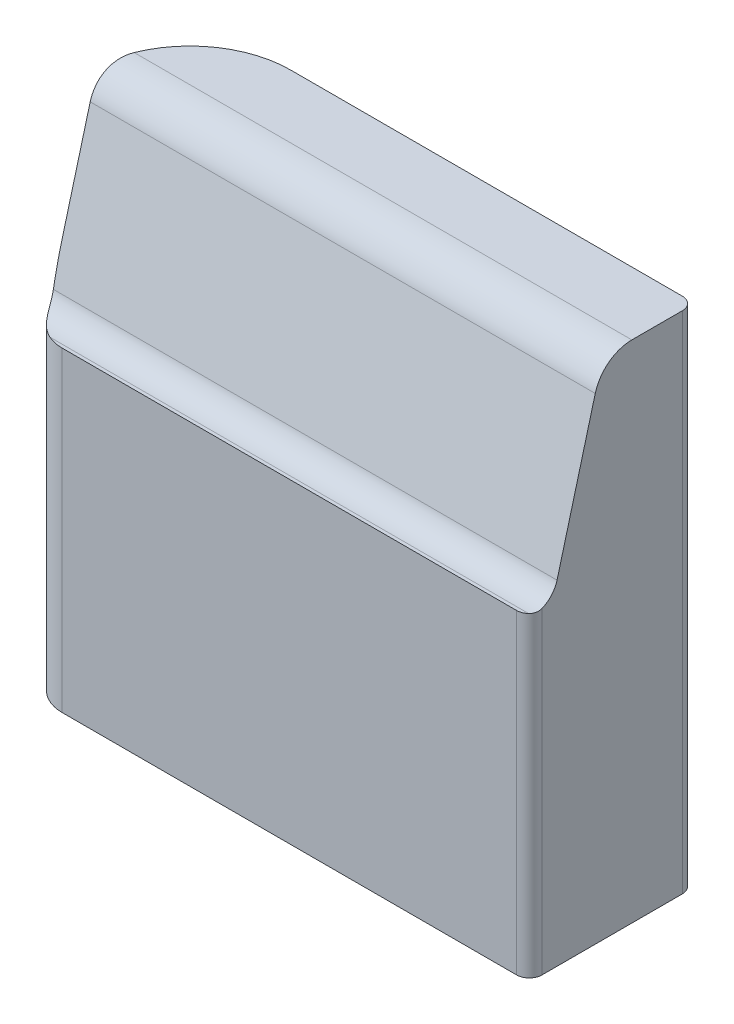
ISO-10303-21;
HEADER;
FILE_DESCRIPTION(('STEP AP214'),'2;1');
FILE_NAME('part.step','',(''),(''),'','','');
FILE_SCHEMA(('AUTOMOTIVE_DESIGN { 1 0 10303 214 1 1 1 1 }'));
ENDSEC;
DATA;
#1=APPLICATION_CONTEXT('core data for automotive mechanical design processes');
#2=APPLICATION_PROTOCOL_DEFINITION('international standard','automotive_design',2000,#1);
#3=PRODUCT_CONTEXT('',#1,'mechanical');
#4=PRODUCT('Part','Part','',(#3));
#5=PRODUCT_RELATED_PRODUCT_CATEGORY('part','',(#4));
#6=PRODUCT_DEFINITION_FORMATION('','',#4);
#7=PRODUCT_DEFINITION_CONTEXT('part definition',#1,'design');
#8=PRODUCT_DEFINITION('design','',#6,#7);
#9=PRODUCT_DEFINITION_SHAPE('','',#8);
#10=(LENGTH_UNIT() NAMED_UNIT(*) SI_UNIT(.MILLI.,.METRE.));
#11=(NAMED_UNIT(*) PLANE_ANGLE_UNIT() SI_UNIT($,.RADIAN.));
#12=(NAMED_UNIT(*) SI_UNIT($,.STERADIAN.) SOLID_ANGLE_UNIT());
#13=UNCERTAINTY_MEASURE_WITH_UNIT(LENGTH_MEASURE(1.E-05),#10,'distance_accuracy_value','');
#14=(GEOMETRIC_REPRESENTATION_CONTEXT(3) GLOBAL_UNCERTAINTY_ASSIGNED_CONTEXT((#13)) GLOBAL_UNIT_ASSIGNED_CONTEXT((#10,
#11,#12)) REPRESENTATION_CONTEXT('',''));
#15=CARTESIAN_POINT('',(0.,0.,0.));
#16=DIRECTION('',(0.,0.,1.));
#17=DIRECTION('',(1.,0.,0.));
#18=AXIS2_PLACEMENT_3D('',#15,#16,#17);
#19=CARTESIAN_POINT('',(20.,-3.,5.));
#20=DIRECTION('',(-1.,0.,0.));
#21=DIRECTION('',(0.,0.,1.));
#22=AXIS2_PLACEMENT_3D('',#19,#20,#21);
#23=CYLINDRICAL_SURFACE('',#22,3.);
#24=DIRECTION('',(-1.,0.,0.));
#25=VECTOR('',#24,1.);
#26=CARTESIAN_POINT('',(20.,0.,5.));
#27=LINE('',#26,#25);
#28=CARTESIAN_POINT('',(20.,0.,5.));
#29=VERTEX_POINT('',#28);
#30=CARTESIAN_POINT('',(-19.4161984870957,0.,5.));
#31=VERTEX_POINT('',#30);
#32=EDGE_CURVE('E183',#29,#31,#27,.T.);
#33=ORIENTED_EDGE('',*,*,#32,.T.);
#34=CARTESIAN_POINT('',(-19.4161984870957,0.,5.));
#35=CARTESIAN_POINT('',(-19.4476398910571,8.44615215946744E-06,5.07769598822021));
#36=CARTESIAN_POINT('',(-19.4778448347174,-0.00301875547096458,5.155905999336));
#37=CARTESIAN_POINT('',(-19.5356515093298,-0.0153183936879546,5.3128258372859));
#38=CARTESIAN_POINT('',(-19.5632522820662,-0.0245931189469453,5.39153583681081));
#39=CARTESIAN_POINT('',(-19.6157162275312,-0.0495711248398902,5.54892712936012));
#40=CARTESIAN_POINT('',(-19.6405773852055,-0.0652790977595611,5.62760835938605));
#41=CARTESIAN_POINT('',(-19.6874565688875,-0.103189547508719,5.78421388711505));
#42=CARTESIAN_POINT('',(-19.7094750016502,-0.125391093708975,5.8621382916306));
#43=CARTESIAN_POINT('',(-19.771329198685,-0.201933977518062,6.09422279218903));
#44=CARTESIAN_POINT('',(-19.8068739890091,-0.266171386367017,6.2464211560772));
#45=CARTESIAN_POINT('',(-19.8669872290354,-0.419842800390661,6.53953554478387));
#46=CARTESIAN_POINT('',(-19.8915692423017,-0.509245445419557,6.68046533324962));
#47=CARTESIAN_POINT('',(-19.9307456722422,-0.707411825846414,6.94164253575932));
#48=CARTESIAN_POINT('',(-19.9456596657797,-0.815388020681755,7.0624413560816));
#49=CARTESIAN_POINT('',(-19.9688210405371,-1.04995090657302,7.28549813096223));
#50=CARTESIAN_POINT('',(-19.9770612888708,-1.17655733931868,7.38773615750423));
#51=CARTESIAN_POINT('',(-19.9861108573365,-1.38001634318352,7.52641157421995));
#52=CARTESIAN_POINT('',(-19.9885878620751,-1.45149140429164,7.57083734672452));
#53=CARTESIAN_POINT('',(-19.9926020993526,-1.59796188968992,7.6535548795928));
#54=CARTESIAN_POINT('',(-19.9941392743925,-1.67295752906751,7.69184626454784));
#55=CARTESIAN_POINT('',(-19.9965356521875,-1.82586769254523,7.76197118100954));
#56=CARTESIAN_POINT('',(-19.9973951939427,-1.90378073669086,7.79380793565077));
#57=CARTESIAN_POINT('',(-19.9986580518514,-2.06200274569308,7.85083227948489));
#58=CARTESIAN_POINT('',(-19.9990613891509,-2.14231159932233,7.8760201768232));
#59=CARTESIAN_POINT('',(-19.9993468831007,-2.22354286469243,7.8977774788672));
#60=B_SPLINE_CURVE_WITH_KNOTS('',3,(#34,#35,#36,#37,#38,#39,#40,#41,#42,#43,#44,#45,#46,#47,#48,
#49,#50,#51,#52,#53,#54,#55,#56,#57,#58,#59),.UNSPECIFIED.,.F.,.F.,(4,2,2,2,2,2,2,2,2,2,2,2,4),
(0.,0.251402016056363,0.502896178728765,0.754574103963112,1.00621597752705,1.51035980882775,
2.01387815194398,2.49976580321802,2.98617208748072,3.23850001379153,3.4908433760256,
3.74306041796446,3.99526576869457),.UNSPECIFIED.);
#61=CARTESIAN_POINT('',(-19.9993468831007,-2.22354286469243,7.8977774788672));
#62=VERTEX_POINT('',#61);
#63=EDGE_CURVE('E258',#31,#62,#60,.T.);
#64=ORIENTED_EDGE('',*,*,#63,.T.);
#65=DIRECTION('',(-1.,0.,0.));
#66=VECTOR('',#65,1.);
#67=CARTESIAN_POINT('',(20.,-2.22354286469243,7.8977774788672));
#68=LINE('',#67,#66);
#69=CARTESIAN_POINT('',(20.,-2.22354286469243,7.8977774788672));
#70=VERTEX_POINT('',#69);
#71=EDGE_CURVE('E200',#70,#62,#68,.T.);
#72=ORIENTED_EDGE('',*,*,#71,.F.);
#73=CARTESIAN_POINT('',(20.,-3.,5.));
#74=DIRECTION('',(1.,0.,0.));
#75=DIRECTION('',(0.,0.,1.));
#76=AXIS2_PLACEMENT_3D('',#73,#74,#75);
#77=CIRCLE('',#76,3.);
#78=EDGE_CURVE('E171',#29,#70,#77,.T.);
#79=ORIENTED_EDGE('',*,*,#78,.F.);
#80=EDGE_LOOP('',(#33,#64,#72,#79));
#81=FACE_BOUND('',#80,.T.);
#82=ADVANCED_FACE('F50',(#81),#23,.T.);
#83=CARTESIAN_POINT('',(20.,-15.,11.3212188504038));
#84=DIRECTION('',(0.,-0.258819045102525,-0.965925826289067));
#85=DIRECTION('',(0.,0.965925826289067,-0.258819045102525));
#86=AXIS2_PLACEMENT_3D('',#83,#84,#85);
#87=PLANE('',#86);
#88=DIRECTION('',(0.,-0.965925826289067,0.258819045102525));
#89=VECTOR('',#88,1.);
#90=CARTESIAN_POINT('',(-20.,-15.,11.3212188504038));
#91=LINE('',#90,#89);
#92=CARTESIAN_POINT('',(-20.,-2.60504250723782,8.));
#93=VERTEX_POINT('',#92);
#94=CARTESIAN_POINT('',(-20.,-10.5169902192837,10.12));
#95=VERTEX_POINT('',#94);
#96=EDGE_CURVE('E170',#93,#95,#91,.T.);
#97=ORIENTED_EDGE('',*,*,#96,.T.);
#98=CARTESIAN_POINT('',(-17.,-10.5169902192837,10.12));
#99=DIRECTION('',(0.,-0.258819045102525,-0.965925826289067));
#100=DIRECTION('',(0.,0.965925826289067,-0.258819045102525));
#101=AXIS2_PLACEMENT_3D('',#98,#99,#100);
#102=ELLIPSE('',#101,11.5911099154686,3.);
#103=CARTESIAN_POINT('',(-19.8902508458796,-13.5176380902051,10.9240211737836));
#104=VERTEX_POINT('',#103);
#105=EDGE_CURVE('E73',#95,#104,#102,.F.);
#106=ORIENTED_EDGE('',*,*,#105,.T.);
#107=DIRECTION('',(-1.,0.,0.));
#108=VECTOR('',#107,1.);
#109=CARTESIAN_POINT('',(20.,-13.5176380902051,10.9240211737836));
#110=LINE('',#109,#108);
#111=CARTESIAN_POINT('',(20.,-13.5176380902051,10.9240211737836));
#112=VERTEX_POINT('',#111);
#113=EDGE_CURVE('E224',#104,#112,#110,.F.);
#114=ORIENTED_EDGE('',*,*,#113,.T.);
#115=DIRECTION('',(0.,-0.965925826289067,0.258819045102525));
#116=VECTOR('',#115,1.);
#117=CARTESIAN_POINT('',(20.,-15.,11.3212188504038));
#118=LINE('',#117,#116);
#119=EDGE_CURVE('E174',#70,#112,#118,.T.);
#120=ORIENTED_EDGE('',*,*,#119,.F.);
#121=ORIENTED_EDGE('',*,*,#71,.T.);
#122=CARTESIAN_POINT('',(-12.,-2.60504250723782,8.));
#123=DIRECTION('',(0.,-0.258819045102525,-0.965925826289067));
#124=DIRECTION('',(0.,-0.965925826289067,0.258819045102525));
#125=AXIS2_PLACEMENT_3D('',#122,#123,#124);
#126=ELLIPSE('',#125,30.9096264412497,8.);
#127=EDGE_CURVE('E264',#62,#93,#126,.F.);
#128=ORIENTED_EDGE('',*,*,#127,.T.);
#129=EDGE_LOOP('',(#97,#106,#114,#120,#121,#128));
#130=FACE_BOUND('',#129,.T.);
#131=ADVANCED_FACE('F254',(#130),#87,.F.);
#132=CARTESIAN_POINT('',(20.,-15.,13.12));
#133=DIRECTION('',(0.,-1.,0.));
#134=DIRECTION('',(0.,0.,-1.));
#135=AXIS2_PLACEMENT_3D('',#132,#133,#134);
#136=PLANE('',#135);
#137=DIRECTION('',(-1.,0.,0.));
#138=VECTOR('',#137,1.);
#139=CARTESIAN_POINT('',(-20.,-15.,12.8558728263617));
#140=LINE('',#139,#138);
#141=CARTESIAN_POINT('',(19.6771197703674,-15.,12.8558728263617));
#142=VERTEX_POINT('',#141);
#143=CARTESIAN_POINT('',(-18.2308533129401,-15.,12.8558728263617));
#144=VERTEX_POINT('',#143);
#145=EDGE_CURVE('E222',#142,#144,#140,.T.);
#146=ORIENTED_EDGE('',*,*,#145,.T.);
#147=CARTESIAN_POINT('',(-17.,-15.,10.12));
#148=DIRECTION('',(0.,-1.,0.));
#149=DIRECTION('',(0.,0.,-1.));
#150=AXIS2_PLACEMENT_3D('',#147,#148,#149);
#151=CIRCLE('',#150,3.);
#152=CARTESIAN_POINT('',(-17.,-15.,13.12));
#153=VERTEX_POINT('',#152);
#154=EDGE_CURVE('E11',#144,#153,#151,.F.);
#155=ORIENTED_EDGE('',*,*,#154,.T.);
#156=DIRECTION('',(-1.,0.,0.));
#157=VECTOR('',#156,1.);
#158=CARTESIAN_POINT('',(20.,-15.,13.12));
#159=LINE('',#158,#157);
#160=CARTESIAN_POINT('',(19.,-15.,13.12));
#161=VERTEX_POINT('',#160);
#162=EDGE_CURVE('E197',#161,#153,#159,.T.);
#163=ORIENTED_EDGE('',*,*,#162,.F.);
#164=CARTESIAN_POINT('',(19.,-15.,12.12));
#165=DIRECTION('',(0.,-1.,0.));
#166=DIRECTION('',(0.,0.,-1.));
#167=AXIS2_PLACEMENT_3D('',#164,#165,#166);
#168=CIRCLE('',#167,1.);
#169=EDGE_CURVE('E219',#161,#142,#168,.F.);
#170=ORIENTED_EDGE('',*,*,#169,.T.);
#171=EDGE_LOOP('',(#146,#155,#163,#170));
#172=FACE_BOUND('',#171,.T.);
#173=ADVANCED_FACE('F310',(#172),#136,.F.);
#174=CARTESIAN_POINT('',(20.,-40.,13.12));
#175=DIRECTION('',(0.,0.,-1.));
#176=DIRECTION('',(-1.,0.,0.));
#177=AXIS2_PLACEMENT_3D('',#174,#175,#176);
#178=PLANE('',#177);
#179=ORIENTED_EDGE('',*,*,#162,.T.);
#180=DIRECTION('',(0.,-1.,0.));
#181=VECTOR('',#180,1.);
#182=CARTESIAN_POINT('',(-17.,-40.,13.12));
#183=LINE('',#182,#181);
#184=CARTESIAN_POINT('',(-17.,-40.,13.12));
#185=VERTEX_POINT('',#184);
#186=EDGE_CURVE('E289',#153,#185,#183,.T.);
#187=ORIENTED_EDGE('',*,*,#186,.T.);
#188=DIRECTION('',(-1.,0.,0.));
#189=VECTOR('',#188,1.);
#190=CARTESIAN_POINT('',(20.,-40.,13.12));
#191=LINE('',#190,#189);
#192=CARTESIAN_POINT('',(19.,-40.,13.12));
#193=VERTEX_POINT('',#192);
#194=EDGE_CURVE('E194',#193,#185,#191,.T.);
#195=ORIENTED_EDGE('',*,*,#194,.F.);
#196=DIRECTION('',(0.,-1.,0.));
#197=VECTOR('',#196,1.);
#198=CARTESIAN_POINT('',(19.,-40.,13.12));
#199=LINE('',#198,#197);
#200=EDGE_CURVE('E217',#193,#161,#199,.F.);
#201=ORIENTED_EDGE('',*,*,#200,.T.);
#202=EDGE_LOOP('',(#179,#187,#195,#201));
#203=FACE_BOUND('',#202,.T.);
#204=ADVANCED_FACE('F313',(#203),#178,.F.);
#205=CARTESIAN_POINT('',(20.,-40.,0.));
#206=DIRECTION('',(0.,1.,0.));
#207=DIRECTION('',(0.,0.,1.));
#208=AXIS2_PLACEMENT_3D('',#205,#206,#207);
#209=PLANE('',#208);
#210=CARTESIAN_POINT('',(13.,-40.,6.56));
#211=DIRECTION('',(0.,-1.,0.));
#212=DIRECTION('',(0.,0.,-1.));
#213=AXIS2_PLACEMENT_3D('',#210,#211,#212);
#214=CIRCLE('',#213,3.025);
#215=CARTESIAN_POINT('',(13.,-40.,3.535));
#216=VERTEX_POINT('',#215);
#217=EDGE_CURVE('E161',#216,#216,#214,.T.);
#218=ORIENTED_EDGE('',*,*,#217,.F.);
#219=EDGE_LOOP('',(#218));
#220=FACE_BOUND('',#219,.T.);
#221=CARTESIAN_POINT('',(-9.86933288150908,-40.,6.56));
#222=DIRECTION('',(0.,-1.,0.));
#223=DIRECTION('',(0.,0.,-1.));
#224=AXIS2_PLACEMENT_3D('',#221,#222,#223);
#225=CIRCLE('',#224,3.025);
#226=CARTESIAN_POINT('',(-9.86933288150908,-40.,3.535));
#227=VERTEX_POINT('',#226);
#228=EDGE_CURVE('E154',#227,#227,#225,.T.);
#229=ORIENTED_EDGE('',*,*,#228,.F.);
#230=EDGE_LOOP('',(#229));
#231=FACE_BOUND('',#230,.T.);
#232=ORIENTED_EDGE('',*,*,#194,.T.);
#233=CARTESIAN_POINT('',(-17.,-40.,10.12));
#234=DIRECTION('',(0.,1.,0.));
#235=DIRECTION('',(0.,0.,1.));
#236=AXIS2_PLACEMENT_3D('',#233,#234,#235);
#237=CIRCLE('',#236,3.);
#238=CARTESIAN_POINT('',(-20.,-40.,10.12));
#239=VERTEX_POINT('',#238);
#240=EDGE_CURVE('E292',#185,#239,#237,.F.);
#241=ORIENTED_EDGE('',*,*,#240,.T.);
#242=DIRECTION('',(0.,0.,-1.));
#243=VECTOR('',#242,1.);
#244=CARTESIAN_POINT('',(-20.,-40.,0.));
#245=LINE('',#244,#243);
#246=CARTESIAN_POINT('',(-20.,-40.,7.99999999999999));
#247=VERTEX_POINT('',#246);
#248=EDGE_CURVE('E175',#239,#247,#245,.T.);
#249=ORIENTED_EDGE('',*,*,#248,.T.);
#250=CARTESIAN_POINT('',(-12.,-40.,7.99999999999999));
#251=DIRECTION('',(0.,1.,0.));
#252=DIRECTION('',(0.,0.,1.));
#253=AXIS2_PLACEMENT_3D('',#250,#251,#252);
#254=CIRCLE('',#253,8.);
#255=CARTESIAN_POINT('',(-12.,-40.,0.));
#256=VERTEX_POINT('',#255);
#257=EDGE_CURVE('E282',#247,#256,#254,.F.);
#258=ORIENTED_EDGE('',*,*,#257,.T.);
#259=DIRECTION('',(-1.,0.,0.));
#260=VECTOR('',#259,1.);
#261=CARTESIAN_POINT('',(20.,-40.,0.));
#262=LINE('',#261,#260);
#263=CARTESIAN_POINT('',(19.,-40.,0.));
#264=VERTEX_POINT('',#263);
#265=EDGE_CURVE('E191',#264,#256,#262,.T.);
#266=ORIENTED_EDGE('',*,*,#265,.F.);
#267=CARTESIAN_POINT('',(19.,-40.,0.999999999999995));
#268=DIRECTION('',(0.,1.,0.));
#269=DIRECTION('',(0.,0.,1.));
#270=AXIS2_PLACEMENT_3D('',#267,#268,#269);
#271=CIRCLE('',#270,1.);
#272=CARTESIAN_POINT('',(20.,-40.,0.999999999999995));
#273=VERTEX_POINT('',#272);
#274=EDGE_CURVE('E215',#264,#273,#271,.F.);
#275=ORIENTED_EDGE('',*,*,#274,.T.);
#276=DIRECTION('',(0.,0.,-1.));
#277=VECTOR('',#276,1.);
#278=CARTESIAN_POINT('',(20.,-40.,0.));
#279=LINE('',#278,#277);
#280=CARTESIAN_POINT('',(20.,-40.,12.12));
#281=VERTEX_POINT('',#280);
#282=EDGE_CURVE('E178',#281,#273,#279,.T.);
#283=ORIENTED_EDGE('',*,*,#282,.F.);
#284=CARTESIAN_POINT('',(19.,-40.,12.12));
#285=DIRECTION('',(0.,1.,0.));
#286=DIRECTION('',(0.,0.,1.));
#287=AXIS2_PLACEMENT_3D('',#284,#285,#286);
#288=CIRCLE('',#287,1.);
#289=EDGE_CURVE('E213',#281,#193,#288,.F.);
#290=ORIENTED_EDGE('',*,*,#289,.T.);
#291=EDGE_LOOP('',(#232,#241,#249,#258,#266,#275,#283,#290));
#292=FACE_BOUND('',#291,.T.);
#293=ADVANCED_FACE('F333',(#220,#231,#292),#209,.F.);
#294=CARTESIAN_POINT('',(20.,0.,0.));
#295=DIRECTION('',(0.,0.,1.));
#296=DIRECTION('',(0.,-1.,0.));
#297=AXIS2_PLACEMENT_3D('',#294,#295,#296);
#298=PLANE('',#297);
#299=ORIENTED_EDGE('',*,*,#265,.T.);
#300=DIRECTION('',(0.,1.,0.));
#301=VECTOR('',#300,1.);
#302=CARTESIAN_POINT('',(-12.,0.,0.));
#303=LINE('',#302,#301);
#304=CARTESIAN_POINT('',(-12.,0.,0.));
#305=VERTEX_POINT('',#304);
#306=EDGE_CURVE('E237',#256,#305,#303,.T.);
#307=ORIENTED_EDGE('',*,*,#306,.T.);
#308=DIRECTION('',(-1.,0.,0.));
#309=VECTOR('',#308,1.);
#310=CARTESIAN_POINT('',(20.,0.,0.));
#311=LINE('',#310,#309);
#312=CARTESIAN_POINT('',(19.,0.,0.));
#313=VERTEX_POINT('',#312);
#314=EDGE_CURVE('E188',#313,#305,#311,.T.);
#315=ORIENTED_EDGE('',*,*,#314,.F.);
#316=DIRECTION('',(0.,1.,0.));
#317=VECTOR('',#316,1.);
#318=CARTESIAN_POINT('',(19.,0.,0.));
#319=LINE('',#318,#317);
#320=EDGE_CURVE('E211',#313,#264,#319,.F.);
#321=ORIENTED_EDGE('',*,*,#320,.T.);
#322=EDGE_LOOP('',(#299,#307,#315,#321));
#323=FACE_BOUND('',#322,.T.);
#324=ADVANCED_FACE('F330',(#323),#298,.F.);
#325=CARTESIAN_POINT('',(20.,0.,5.));
#326=DIRECTION('',(0.,-1.,0.));
#327=DIRECTION('',(0.,0.,-1.));
#328=AXIS2_PLACEMENT_3D('',#325,#326,#327);
#329=PLANE('',#328);
#330=ORIENTED_EDGE('',*,*,#314,.T.);
#331=CARTESIAN_POINT('',(-12.,0.,8.));
#332=DIRECTION('',(0.,-1.,0.));
#333=DIRECTION('',(0.,0.,-1.));
#334=AXIS2_PLACEMENT_3D('',#331,#332,#333);
#335=CIRCLE('',#334,8.);
#336=EDGE_CURVE('E265',#305,#31,#335,.F.);
#337=ORIENTED_EDGE('',*,*,#336,.T.);
#338=ORIENTED_EDGE('',*,*,#32,.F.);
#339=DIRECTION('',(0.,0.,1.));
#340=VECTOR('',#339,1.);
#341=CARTESIAN_POINT('',(20.,0.,5.));
#342=LINE('',#341,#340);
#343=CARTESIAN_POINT('',(20.,0.,1.));
#344=VERTEX_POINT('',#343);
#345=EDGE_CURVE('E181',#344,#29,#342,.T.);
#346=ORIENTED_EDGE('',*,*,#345,.F.);
#347=CARTESIAN_POINT('',(19.,0.,1.));
#348=DIRECTION('',(0.,-1.,0.));
#349=DIRECTION('',(0.,0.,-1.));
#350=AXIS2_PLACEMENT_3D('',#347,#348,#349);
#351=CIRCLE('',#350,1.);
#352=EDGE_CURVE('E209',#344,#313,#351,.F.);
#353=ORIENTED_EDGE('',*,*,#352,.T.);
#354=EDGE_LOOP('',(#330,#337,#338,#346,#353));
#355=FACE_BOUND('',#354,.T.);
#356=ADVANCED_FACE('F327',(#355),#329,.F.);
#357=CARTESIAN_POINT('',(20.,-3.,5.));
#358=DIRECTION('',(-1.,0.,0.));
#359=DIRECTION('',(0.,0.,1.));
#360=AXIS2_PLACEMENT_3D('',#357,#358,#359);
#361=PLANE('',#360);
#362=ORIENTED_EDGE('',*,*,#282,.T.);
#363=DIRECTION('',(0.,1.,0.));
#364=VECTOR('',#363,1.);
#365=CARTESIAN_POINT('',(20.,-3.,1.));
#366=LINE('',#365,#364);
#367=EDGE_CURVE('E206',#273,#344,#366,.T.);
#368=ORIENTED_EDGE('',*,*,#367,.T.);
#369=ORIENTED_EDGE('',*,*,#345,.T.);
#370=ORIENTED_EDGE('',*,*,#78,.T.);
#371=ORIENTED_EDGE('',*,*,#119,.T.);
#372=CARTESIAN_POINT('',(20.,-13.,12.8558728263617));
#373=DIRECTION('',(-1.,0.,0.));
#374=DIRECTION('',(0.,0.,1.));
#375=AXIS2_PLACEMENT_3D('',#372,#373,#374);
#376=CIRCLE('',#375,2.);
#377=CARTESIAN_POINT('',(20.,-14.859701907141,12.12));
#378=VERTEX_POINT('',#377);
#379=EDGE_CURVE('E226',#112,#378,#376,.T.);
#380=ORIENTED_EDGE('',*,*,#379,.T.);
#381=DIRECTION('',(0.,-1.,0.));
#382=VECTOR('',#381,1.);
#383=CARTESIAN_POINT('',(20.,-3.,12.12));
#384=LINE('',#383,#382);
#385=EDGE_CURVE('E203',#378,#281,#384,.T.);
#386=ORIENTED_EDGE('',*,*,#385,.T.);
#387=EDGE_LOOP('',(#362,#368,#369,#370,#371,#380,#386));
#388=FACE_BOUND('',#387,.T.);
#389=ADVANCED_FACE('F319',(#388),#361,.F.);
#390=CARTESIAN_POINT('',(-20.,-3.,5.));
#391=DIRECTION('',(-1.,0.,0.));
#392=DIRECTION('',(0.,0.,1.));
#393=AXIS2_PLACEMENT_3D('',#390,#391,#392);
#394=PLANE('',#393);
#395=ORIENTED_EDGE('',*,*,#248,.F.);
#396=DIRECTION('',(0.,-1.,0.));
#397=VECTOR('',#396,1.);
#398=CARTESIAN_POINT('',(-20.,-15.,10.12));
#399=LINE('',#398,#397);
#400=EDGE_CURVE('E296',#239,#95,#399,.F.);
#401=ORIENTED_EDGE('',*,*,#400,.T.);
#402=ORIENTED_EDGE('',*,*,#96,.F.);
#403=DIRECTION('',(0.,1.,0.));
#404=VECTOR('',#403,1.);
#405=CARTESIAN_POINT('',(-20.,-40.,7.99999999999999));
#406=LINE('',#405,#404);
#407=EDGE_CURVE('E285',#93,#247,#406,.F.);
#408=ORIENTED_EDGE('',*,*,#407,.T.);
#409=EDGE_LOOP('',(#395,#401,#402,#408));
#410=FACE_BOUND('',#409,.T.);
#411=ADVANCED_FACE('F249',(#410),#394,.T.);
#412=CARTESIAN_POINT('',(19.,-3.,1.));
#413=DIRECTION('',(0.,1.,0.));
#414=DIRECTION('',(0.,0.,1.));
#415=AXIS2_PLACEMENT_3D('',#412,#413,#414);
#416=CYLINDRICAL_SURFACE('',#415,1.);
#417=ORIENTED_EDGE('',*,*,#274,.F.);
#418=ORIENTED_EDGE('',*,*,#320,.F.);
#419=ORIENTED_EDGE('',*,*,#352,.F.);
#420=ORIENTED_EDGE('',*,*,#367,.F.);
#421=EDGE_LOOP('',(#417,#418,#419,#420));
#422=FACE_BOUND('',#421,.T.);
#423=ADVANCED_FACE('F245',(#422),#416,.T.);
#424=CARTESIAN_POINT('',(19.,-3.,12.12));
#425=DIRECTION('',(0.,-1.,0.));
#426=DIRECTION('',(0.,0.,-1.));
#427=AXIS2_PLACEMENT_3D('',#424,#425,#426);
#428=CYLINDRICAL_SURFACE('',#427,1.);
#429=ORIENTED_EDGE('',*,*,#169,.F.);
#430=ORIENTED_EDGE('',*,*,#200,.F.);
#431=ORIENTED_EDGE('',*,*,#289,.F.);
#432=ORIENTED_EDGE('',*,*,#385,.F.);
#433=CARTESIAN_POINT('',(20.,-14.859701907141,12.12));
#434=CARTESIAN_POINT('',(20.0000001935486,-14.8694118321477,12.1445336772066));
#435=CARTESIAN_POINT('',(19.9990961202643,-14.8786290822711,12.1692538622716));
#436=CARTESIAN_POINT('',(19.9954074262291,-14.8960442418709,12.2189203735111));
#437=CARTESIAN_POINT('',(19.9926221807557,-14.9042418116482,12.2438667720934));
#438=CARTESIAN_POINT('',(19.9813563280003,-14.9272063096947,12.3186748128191));
#439=CARTESIAN_POINT('',(19.9699663008288,-14.9403941075581,12.3686299622683));
#440=CARTESIAN_POINT('',(19.9392353942119,-14.9625121243205,12.4671459415411));
#441=CARTESIAN_POINT('',(19.9198730420564,-14.9714307030877,12.5157026238672));
#442=CARTESIAN_POINT('',(19.8735117148591,-14.9853472100168,12.6096058643525));
#443=CARTESIAN_POINT('',(19.8465177936764,-14.9903477246034,12.6549545221994));
#444=CARTESIAN_POINT('',(19.7957947413132,-14.9960248965357,12.7265859145127));
#445=CARTESIAN_POINT('',(19.7739802106266,-14.9975874644007,12.7541825327519));
#446=CARTESIAN_POINT('',(19.7275716768204,-14.9995752885075,12.8069313631768));
#447=CARTESIAN_POINT('',(19.7029802746172,-15.0000015999472,12.8320858223645));
#448=CARTESIAN_POINT('',(19.6771197703674,-15.,12.8558728263617));
#449=B_SPLINE_CURVE_WITH_KNOTS('',3,(#433,#434,#435,#436,#437,#438,#439,#440,#441,#442,#443,
#444,#445,#446,#447,#448),.UNSPECIFIED.,.F.,.F.,(4,2,2,2,2,2,2,4),(0.,0.0791166270435355,
0.158259541030067,0.31614837990305,0.474465288657007,0.632677599697184,0.738114478953398,
0.843453408855515),.UNSPECIFIED.);
#450=EDGE_CURVE('E229',#378,#142,#449,.T.);
#451=ORIENTED_EDGE('',*,*,#450,.T.);
#452=EDGE_LOOP('',(#429,#430,#431,#432,#451));
#453=FACE_BOUND('',#452,.T.);
#454=ADVANCED_FACE('F241',(#453),#428,.T.);
#455=CARTESIAN_POINT('',(20.,-13.,12.8558728263617));
#456=DIRECTION('',(1.,0.,0.));
#457=DIRECTION('',(0.,0.,-1.));
#458=AXIS2_PLACEMENT_3D('',#455,#456,#457);
#459=CYLINDRICAL_SURFACE('',#458,2.);
#460=ORIENTED_EDGE('',*,*,#113,.F.);
#461=CARTESIAN_POINT('',(-19.8902508458796,-13.5176380902051,10.9240211737836));
#462=CARTESIAN_POINT('',(-19.8864984296544,-13.5679024690481,10.9374821393241));
#463=CARTESIAN_POINT('',(-19.8821137576885,-13.617594800411,10.9529068636914));
#464=CARTESIAN_POINT('',(-19.8718889609612,-13.7155058227396,10.9875203556151));
#465=CARTESIAN_POINT('',(-19.866048586985,-13.7637242597876,11.0067097675628));
#466=CARTESIAN_POINT('',(-19.8527187656465,-13.8583677208284,11.0486965126411));
#467=CARTESIAN_POINT('',(-19.8452283711467,-13.9047916967081,11.071495915841));
#468=CARTESIAN_POINT('',(-19.8283883063497,-13.9954649809607,11.1204451175746));
#469=CARTESIAN_POINT('',(-19.8190387844384,-14.0397144625393,11.1465946486593));
#470=CARTESIAN_POINT('',(-19.7878076820762,-14.1689009275919,11.2297931151599));
#471=CARTESIAN_POINT('',(-19.7627588115595,-14.2501578989886,11.2915390558909));
#472=CARTESIAN_POINT('',(-19.7026104810142,-14.4002184284027,11.4242918273325));
#473=CARTESIAN_POINT('',(-19.6675237346196,-14.4690375609777,11.4952868818681));
#474=CARTESIAN_POINT('',(-19.5875186909825,-14.590948802466,11.6403196525287));
#475=CARTESIAN_POINT('',(-19.5429505176711,-14.6444733165972,11.7141875648768));
#476=CARTESIAN_POINT('',(-19.4432913425453,-14.7384288630486,11.8630855901346));
#477=CARTESIAN_POINT('',(-19.3882000986102,-14.778859594042,11.9381157297491));
#478=CARTESIAN_POINT('',(-19.266847409256,-14.848372753709,12.0874539281945));
#479=CARTESIAN_POINT('',(-19.200359781537,-14.8771752097177,12.161706452728));
#480=CARTESIAN_POINT('',(-19.0582460461143,-14.9240943623681,12.3049087979308));
#481=CARTESIAN_POINT('',(-18.9825991151235,-14.9421861376783,12.3738459295398));
#482=CARTESIAN_POINT('',(-18.8523172324221,-14.9649756511824,12.480778185869));
#483=CARTESIAN_POINT('',(-18.7998870801666,-14.9721501461677,12.5209975578941));
#484=CARTESIAN_POINT('',(-18.6922495821686,-14.9836928690933,12.5980373393276));
#485=CARTESIAN_POINT('',(-18.6370409642348,-14.9880597986782,12.634856169429));
#486=CARTESIAN_POINT('',(-18.524486527815,-14.9945802508804,12.7046285116539));
#487=CARTESIAN_POINT('',(-18.4671521735438,-14.9967442431846,12.7375996415625));
#488=CARTESIAN_POINT('',(-18.3504580981743,-14.9994487404871,12.7996706313424));
#489=CARTESIAN_POINT('',(-18.2911004279551,-14.9999908427221,12.8287742728982));
#490=CARTESIAN_POINT('',(-18.2308533129401,-15.,12.8558728263617));
#491=B_SPLINE_CURVE_WITH_KNOTS('',3,(#461,#462,#463,#464,#465,#466,#467,#468,#469,#470,#471,
#472,#473,#474,#475,#476,#477,#478,#479,#480,#481,#482,#483,#484,#485,#486,#487,#488,#489,#490),
.UNSPECIFIED.,.F.,.F.,(4,2,2,2,2,2,2,2,2,2,2,2,2,2,4),(0.,0.156469621218463,0.312966048315225,
0.46955254198884,0.626126542750246,0.939660200156916,1.25279849131873,1.55592710613385,
1.85906269634071,2.16911469203573,2.47988530176882,2.67910188119097,2.87841052195617,
3.07676744218054,3.27492895619583),.UNSPECIFIED.);
#492=EDGE_CURVE('E59',#104,#144,#491,.T.);
#493=ORIENTED_EDGE('',*,*,#492,.T.);
#494=ORIENTED_EDGE('',*,*,#145,.F.);
#495=ORIENTED_EDGE('',*,*,#450,.F.);
#496=ORIENTED_EDGE('',*,*,#379,.F.);
#497=EDGE_LOOP('',(#460,#493,#494,#495,#496));
#498=FACE_BOUND('',#497,.T.);
#499=ADVANCED_FACE('F239',(#498),#459,.F.);
#500=CARTESIAN_POINT('',(-12.,0.,8.));
#501=DIRECTION('',(0.,-1.,0.));
#502=DIRECTION('',(0.,0.,-1.));
#503=AXIS2_PLACEMENT_3D('',#500,#501,#502);
#504=CYLINDRICAL_SURFACE('',#503,8.);
#505=ORIENTED_EDGE('',*,*,#257,.F.);
#506=ORIENTED_EDGE('',*,*,#407,.F.);
#507=ORIENTED_EDGE('',*,*,#127,.F.);
#508=ORIENTED_EDGE('',*,*,#63,.F.);
#509=ORIENTED_EDGE('',*,*,#336,.F.);
#510=ORIENTED_EDGE('',*,*,#306,.F.);
#511=EDGE_LOOP('',(#505,#506,#507,#508,#509,#510));
#512=FACE_BOUND('',#511,.T.);
#513=ADVANCED_FACE('F267',(#512),#504,.T.);
#514=CARTESIAN_POINT('',(-17.,-40.,10.12));
#515=DIRECTION('',(0.,1.,0.));
#516=DIRECTION('',(0.,0.,1.));
#517=AXIS2_PLACEMENT_3D('',#514,#515,#516);
#518=CYLINDRICAL_SURFACE('',#517,3.);
#519=ORIENTED_EDGE('',*,*,#105,.F.);
#520=ORIENTED_EDGE('',*,*,#400,.F.);
#521=ORIENTED_EDGE('',*,*,#240,.F.);
#522=ORIENTED_EDGE('',*,*,#186,.F.);
#523=ORIENTED_EDGE('',*,*,#154,.F.);
#524=ORIENTED_EDGE('',*,*,#492,.F.);
#525=EDGE_LOOP('',(#519,#520,#521,#522,#523,#524));
#526=FACE_BOUND('',#525,.T.);
#527=ADVANCED_FACE('F52',(#526),#518,.T.);
#528=CARTESIAN_POINT('',(-9.86933288150908,-25.,6.56));
#529=DIRECTION('',(0.,-1.,0.));
#530=DIRECTION('',(0.,0.,-1.));
#531=AXIS2_PLACEMENT_3D('',#528,#529,#530);
#532=CONICAL_SURFACE('',#531,2.49999999999999,1.02974425867665);
#533=CARTESIAN_POINT('',(-9.86933288150908,-23.4978484524311,6.56));
#534=VERTEX_POINT('',#533);
#535=VERTEX_LOOP('',#534);
#536=FACE_BOUND('',#535,.T.);
#537=CARTESIAN_POINT('',(-9.86933288150908,-25.,6.56));
#538=DIRECTION('',(0.,-1.,0.));
#539=DIRECTION('',(0.,0.,-1.));
#540=AXIS2_PLACEMENT_3D('',#537,#538,#539);
#541=CIRCLE('',#540,2.49999999999999);
#542=CARTESIAN_POINT('',(-9.86933288150908,-25.,4.06000000000001));
#543=VERTEX_POINT('',#542);
#544=EDGE_CURVE('E167',#543,#543,#541,.T.);
#545=ORIENTED_EDGE('',*,*,#544,.T.);
#546=EDGE_LOOP('',(#545));
#547=FACE_BOUND('',#546,.T.);
#548=ADVANCED_FACE('F276',(#536,#547),#532,.F.);
#549=CARTESIAN_POINT('',(-9.86933288150908,-40.,6.56));
#550=DIRECTION('',(0.,-1.,0.));
#551=DIRECTION('',(0.,0.,-1.));
#552=AXIS2_PLACEMENT_3D('',#549,#550,#551);
#553=CYLINDRICAL_SURFACE('',#552,2.49999999999999);
#554=ORIENTED_EDGE('',*,*,#544,.F.);
#555=EDGE_LOOP('',(#554));
#556=FACE_BOUND('',#555,.T.);
#557=CARTESIAN_POINT('',(-9.86933288150908,-39.475,6.56));
#558=DIRECTION('',(0.,-1.,0.));
#559=DIRECTION('',(0.,0.,-1.));
#560=AXIS2_PLACEMENT_3D('',#557,#558,#559);
#561=CIRCLE('',#560,2.5);
#562=CARTESIAN_POINT('',(-9.86933288150908,-39.475,4.06));
#563=VERTEX_POINT('',#562);
#564=EDGE_CURVE('E158',#563,#563,#561,.T.);
#565=ORIENTED_EDGE('',*,*,#564,.T.);
#566=EDGE_LOOP('',(#565));
#567=FACE_BOUND('',#566,.T.);
#568=ADVANCED_FACE('F440',(#556,#567),#553,.F.);
#569=CARTESIAN_POINT('',(-9.86933288150908,-40.,6.56));
#570=DIRECTION('',(0.,-1.,0.));
#571=DIRECTION('',(0.,0.,-1.));
#572=AXIS2_PLACEMENT_3D('',#569,#570,#571);
#573=CONICAL_SURFACE('',#572,3.025,0.785398163397445);
#574=ORIENTED_EDGE('',*,*,#564,.F.);
#575=EDGE_LOOP('',(#574));
#576=FACE_BOUND('',#575,.T.);
#577=ORIENTED_EDGE('',*,*,#228,.T.);
#578=EDGE_LOOP('',(#577));
#579=FACE_BOUND('',#578,.T.);
#580=ADVANCED_FACE('F148',(#576,#579),#573,.F.);
#581=CARTESIAN_POINT('',(13.,-25.,6.56));
#582=DIRECTION('',(0.,-1.,0.));
#583=DIRECTION('',(0.,0.,-1.));
#584=AXIS2_PLACEMENT_3D('',#581,#582,#583);
#585=CONICAL_SURFACE('',#584,2.49999999999999,1.02974425867665);
#586=CARTESIAN_POINT('',(13.,-23.4978484524311,6.56));
#587=VERTEX_POINT('',#586);
#588=VERTEX_LOOP('',#587);
#589=FACE_BOUND('',#588,.T.);
#590=CARTESIAN_POINT('',(13.,-25.,6.56));
#591=DIRECTION('',(0.,-1.,0.));
#592=DIRECTION('',(0.,0.,-1.));
#593=AXIS2_PLACEMENT_3D('',#590,#591,#592);
#594=CIRCLE('',#593,2.49999999999999);
#595=CARTESIAN_POINT('',(13.,-25.,4.06000000000001));
#596=VERTEX_POINT('',#595);
#597=EDGE_CURVE('E152',#596,#596,#594,.T.);
#598=ORIENTED_EDGE('',*,*,#597,.T.);
#599=EDGE_LOOP('',(#598));
#600=FACE_BOUND('',#599,.T.);
#601=ADVANCED_FACE('F144',(#589,#600),#585,.F.);
#602=CARTESIAN_POINT('',(13.,-40.,6.56));
#603=DIRECTION('',(0.,-1.,0.));
#604=DIRECTION('',(0.,0.,-1.));
#605=AXIS2_PLACEMENT_3D('',#602,#603,#604);
#606=CYLINDRICAL_SURFACE('',#605,2.49999999999999);
#607=ORIENTED_EDGE('',*,*,#597,.F.);
#608=EDGE_LOOP('',(#607));
#609=FACE_BOUND('',#608,.T.);
#610=CARTESIAN_POINT('',(13.,-39.475,6.56));
#611=DIRECTION('',(0.,-1.,0.));
#612=DIRECTION('',(0.,0.,-1.));
#613=AXIS2_PLACEMENT_3D('',#610,#611,#612);
#614=CIRCLE('',#613,2.5);
#615=CARTESIAN_POINT('',(13.,-39.475,4.06));
#616=VERTEX_POINT('',#615);
#617=EDGE_CURVE('E155',#616,#616,#614,.T.);
#618=ORIENTED_EDGE('',*,*,#617,.T.);
#619=EDGE_LOOP('',(#618));
#620=FACE_BOUND('',#619,.T.);
#621=ADVANCED_FACE('F147',(#609,#620),#606,.F.);
#622=CARTESIAN_POINT('',(13.,-40.,6.56));
#623=DIRECTION('',(0.,-1.,0.));
#624=DIRECTION('',(0.,0.,-1.));
#625=AXIS2_PLACEMENT_3D('',#622,#623,#624);
#626=CONICAL_SURFACE('',#625,3.025,0.785398163397445);
#627=ORIENTED_EDGE('',*,*,#617,.F.);
#628=EDGE_LOOP('',(#627));
#629=FACE_BOUND('',#628,.T.);
#630=ORIENTED_EDGE('',*,*,#217,.T.);
#631=EDGE_LOOP('',(#630));
#632=FACE_BOUND('',#631,.T.);
#633=ADVANCED_FACE('F478',(#629,#632),#626,.F.);
#634=CLOSED_SHELL('',(#82,#131,#173,#204,#293,#324,#356,#389,#411,#423,#454,#499,#513,#527,#548,
#568,#580,#601,#621,#633));
#635=MANIFOLD_SOLID_BREP('B2',#634);
#636=ADVANCED_BREP_SHAPE_REPRESENTATION('',(#18,#635),#14);
#637=SHAPE_DEFINITION_REPRESENTATION(#9,#636);
ENDSEC;
END-ISO-10303-21;
